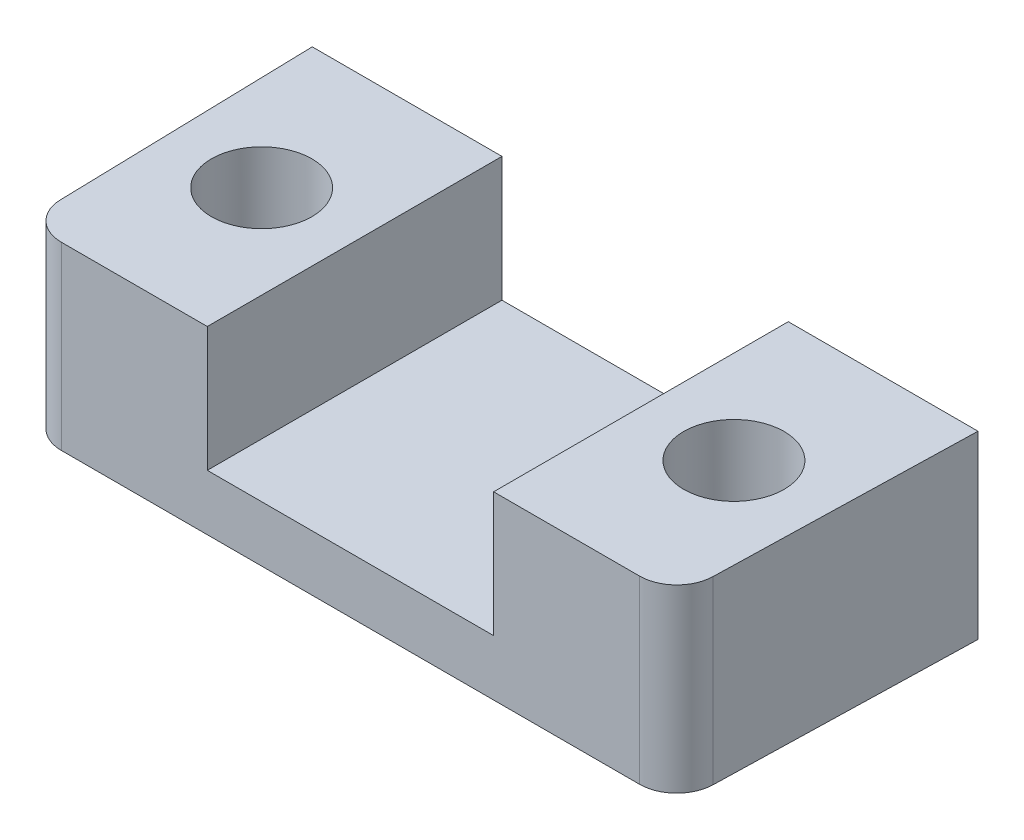
ISO-10303-21;
HEADER;
FILE_DESCRIPTION(('STEP AP214'),'2;1');
FILE_NAME('part.step','',(''),(''),'','','');
FILE_SCHEMA(('AUTOMOTIVE_DESIGN { 1 0 10303 214 1 1 1 1 }'));
ENDSEC;
DATA;
#1=APPLICATION_CONTEXT('core data for automotive mechanical design processes');
#2=APPLICATION_PROTOCOL_DEFINITION('international standard','automotive_design',2000,#1);
#3=PRODUCT_CONTEXT('',#1,'mechanical');
#4=PRODUCT('Part','Part','',(#3));
#5=PRODUCT_RELATED_PRODUCT_CATEGORY('part','',(#4));
#6=PRODUCT_DEFINITION_FORMATION('','',#4);
#7=PRODUCT_DEFINITION_CONTEXT('part definition',#1,'design');
#8=PRODUCT_DEFINITION('design','',#6,#7);
#9=PRODUCT_DEFINITION_SHAPE('','',#8);
#10=(LENGTH_UNIT() NAMED_UNIT(*) SI_UNIT(.MILLI.,.METRE.));
#11=(NAMED_UNIT(*) PLANE_ANGLE_UNIT() SI_UNIT($,.RADIAN.));
#12=(NAMED_UNIT(*) SI_UNIT($,.STERADIAN.) SOLID_ANGLE_UNIT());
#13=UNCERTAINTY_MEASURE_WITH_UNIT(LENGTH_MEASURE(1.E-05),#10,'distance_accuracy_value','');
#14=(GEOMETRIC_REPRESENTATION_CONTEXT(3) GLOBAL_UNCERTAINTY_ASSIGNED_CONTEXT((#13)) GLOBAL_UNIT_ASSIGNED_CONTEXT((#10,
#11,#12)) REPRESENTATION_CONTEXT('',''));
#15=CARTESIAN_POINT('',(0.,0.,0.));
#16=DIRECTION('',(0.,0.,1.));
#17=DIRECTION('',(1.,0.,0.));
#18=AXIS2_PLACEMENT_3D('',#15,#16,#17);
#19=CARTESIAN_POINT('',(15.5503690425272,9.7,-2.00000000000002));
#20=DIRECTION('',(0.,-1.,0.));
#21=DIRECTION('',(0.,0.,-1.));
#22=AXIS2_PLACEMENT_3D('',#19,#20,#21);
#23=PLANE('',#22);
#24=CARTESIAN_POINT('',(12.701076771467,9.7,-7.92453060658859));
#25=DIRECTION('',(0.,-1.,0.));
#26=DIRECTION('',(0.,0.,-1.));
#27=AXIS2_PLACEMENT_3D('',#24,#25,#26);
#28=CIRCLE('',#27,2.69999999999999);
#29=CARTESIAN_POINT('',(12.701076771467,9.7,-10.6245306065886));
#30=VERTEX_POINT('',#29);
#31=EDGE_CURVE('E140',#30,#30,#28,.T.);
#32=ORIENTED_EDGE('',*,*,#31,.T.);
#33=EDGE_LOOP('',(#32));
#34=FACE_BOUND('',#33,.T.);
#35=DIRECTION('',(1.,0.,0.));
#36=VECTOR('',#35,1.);
#37=CARTESIAN_POINT('',(-17.904307085868,9.69999999999999,-15.8490612131772));
#38=LINE('',#37,#36);
#39=CARTESIAN_POINT('',(7.7,9.7,-15.8490612131772));
#40=VERTEX_POINT('',#39);
#41=CARTESIAN_POINT('',(17.904307085868,9.69999999999999,-15.8490612131772));
#42=VERTEX_POINT('',#41);
#43=EDGE_CURVE('E66',#40,#42,#38,.T.);
#44=ORIENTED_EDGE('',*,*,#43,.F.);
#45=DIRECTION('',(0.,0.,1.));
#46=VECTOR('',#45,1.);
#47=CARTESIAN_POINT('',(7.7,9.7,-2.00000000000002));
#48=LINE('',#47,#46);
#49=CARTESIAN_POINT('',(7.7,9.7,0.));
#50=VERTEX_POINT('',#49);
#51=EDGE_CURVE('E12',#40,#50,#48,.T.);
#52=ORIENTED_EDGE('',*,*,#51,.T.);
#53=DIRECTION('',(-1.,0.,0.));
#54=VECTOR('',#53,1.);
#55=CARTESIAN_POINT('',(-15.5503690425272,9.7,0.));
#56=LINE('',#55,#54);
#57=CARTESIAN_POINT('',(15.5503690425272,9.7,0.));
#58=VERTEX_POINT('',#57);
#59=EDGE_CURVE('E156',#58,#50,#56,.T.);
#60=ORIENTED_EDGE('',*,*,#59,.F.);
#61=CARTESIAN_POINT('',(15.5503690425272,9.7,-2.00000000000003));
#62=DIRECTION('',(0.,-1.,0.));
#63=DIRECTION('',(0.,0.,-1.));
#64=AXIS2_PLACEMENT_3D('',#61,#62,#63);
#65=CIRCLE('',#64,2.00000000000001);
#66=CARTESIAN_POINT('',(17.5497186078011,9.7,-1.94899690363395));
#67=VERTEX_POINT('',#66);
#68=EDGE_CURVE('E163',#67,#58,#65,.T.);
#69=ORIENTED_EDGE('',*,*,#68,.F.);
#70=DIRECTION('',(-0.0255015481830356,0.,0.999674782636968));
#71=VECTOR('',#70,1.);
#72=CARTESIAN_POINT('',(17.5497186078011,9.7,-1.94899690363394));
#73=LINE('',#72,#71);
#74=EDGE_CURVE('E160',#42,#67,#73,.T.);
#75=ORIENTED_EDGE('',*,*,#74,.F.);
#76=EDGE_LOOP('',(#44,#52,#60,#69,#75));
#77=FACE_BOUND('',#76,.T.);
#78=ADVANCED_FACE('F42',(#34,#77),#23,.F.);
#79=CARTESIAN_POINT('',(15.5503690425272,0.,-2.00000000000003));
#80=DIRECTION('',(0.,1.,0.));
#81=DIRECTION('',(0.,0.,1.));
#82=AXIS2_PLACEMENT_3D('',#79,#80,#81);
#83=PLANE('',#82);
#84=CARTESIAN_POINT('',(-12.701076771467,0.,-7.92453060658858));
#85=DIRECTION('',(0.,1.,0.));
#86=DIRECTION('',(0.,0.,1.));
#87=AXIS2_PLACEMENT_3D('',#84,#85,#86);
#88=CIRCLE('',#87,2.69999999999999);
#89=CARTESIAN_POINT('',(-12.701076771467,0.,-5.22453060658859));
#90=VERTEX_POINT('',#89);
#91=EDGE_CURVE('E308',#90,#90,#88,.T.);
#92=ORIENTED_EDGE('',*,*,#91,.T.);
#93=EDGE_LOOP('',(#92));
#94=FACE_BOUND('',#93,.T.);
#95=CARTESIAN_POINT('',(12.701076771467,0.,-7.92453060658858));
#96=DIRECTION('',(0.,1.,0.));
#97=DIRECTION('',(0.,0.,1.));
#98=AXIS2_PLACEMENT_3D('',#95,#96,#97);
#99=CIRCLE('',#98,2.69999999999999);
#100=CARTESIAN_POINT('',(12.701076771467,0.,-5.22453060658859));
#101=VERTEX_POINT('',#100);
#102=EDGE_CURVE('E305',#101,#101,#99,.T.);
#103=ORIENTED_EDGE('',*,*,#102,.T.);
#104=EDGE_LOOP('',(#103));
#105=FACE_BOUND('',#104,.T.);
#106=CARTESIAN_POINT('',(15.5503690425272,0.,-2.00000000000003));
#107=DIRECTION('',(0.,1.,0.));
#108=DIRECTION('',(0.,0.,1.));
#109=AXIS2_PLACEMENT_3D('',#106,#107,#108);
#110=CIRCLE('',#109,2.00000000000001);
#111=CARTESIAN_POINT('',(15.5503690425272,0.,0.));
#112=VERTEX_POINT('',#111);
#113=CARTESIAN_POINT('',(17.5497186078011,0.,-1.94899690363395));
#114=VERTEX_POINT('',#113);
#115=EDGE_CURVE('E151',#112,#114,#110,.T.);
#116=ORIENTED_EDGE('',*,*,#115,.F.);
#117=DIRECTION('',(1.,0.,0.));
#118=VECTOR('',#117,1.);
#119=CARTESIAN_POINT('',(-15.5503690425272,0.,0.));
#120=LINE('',#119,#118);
#121=CARTESIAN_POINT('',(-15.5503690425272,0.,0.));
#122=VERTEX_POINT('',#121);
#123=EDGE_CURVE('E180',#122,#112,#120,.T.);
#124=ORIENTED_EDGE('',*,*,#123,.F.);
#125=CARTESIAN_POINT('',(-15.5503690425272,0.,-2.00000000000003));
#126=DIRECTION('',(0.,1.,0.));
#127=DIRECTION('',(0.,0.,1.));
#128=AXIS2_PLACEMENT_3D('',#125,#126,#127);
#129=CIRCLE('',#128,2.00000000000001);
#130=CARTESIAN_POINT('',(-17.5497186078011,0.,-1.94899690363395));
#131=VERTEX_POINT('',#130);
#132=EDGE_CURVE('E177',#131,#122,#129,.T.);
#133=ORIENTED_EDGE('',*,*,#132,.F.);
#134=DIRECTION('',(0.0255015481830353,0.,0.999674782636968));
#135=VECTOR('',#134,1.);
#136=CARTESIAN_POINT('',(-17.904307085868,0.,-15.8490612131772));
#137=LINE('',#136,#135);
#138=CARTESIAN_POINT('',(-17.904307085868,0.,-15.8490612131772));
#139=VERTEX_POINT('',#138);
#140=EDGE_CURVE('E174',#139,#131,#137,.T.);
#141=ORIENTED_EDGE('',*,*,#140,.F.);
#142=DIRECTION('',(-1.,0.,0.));
#143=VECTOR('',#142,1.);
#144=CARTESIAN_POINT('',(-17.904307085868,0.,-15.8490612131772));
#145=LINE('',#144,#143);
#146=CARTESIAN_POINT('',(17.904307085868,0.,-15.8490612131772));
#147=VERTEX_POINT('',#146);
#148=EDGE_CURVE('E171',#147,#139,#145,.T.);
#149=ORIENTED_EDGE('',*,*,#148,.F.);
#150=DIRECTION('',(0.0255015481830356,0.,-0.999674782636968));
#151=VECTOR('',#150,1.);
#152=CARTESIAN_POINT('',(17.5497186078011,0.,-1.94899690363395));
#153=LINE('',#152,#151);
#154=EDGE_CURVE('E168',#114,#147,#153,.T.);
#155=ORIENTED_EDGE('',*,*,#154,.F.);
#156=EDGE_LOOP('',(#116,#124,#133,#141,#149,#155));
#157=FACE_BOUND('',#156,.T.);
#158=ADVANCED_FACE('F217',(#94,#105,#157),#83,.F.);
#159=CARTESIAN_POINT('',(-15.5503690425272,50.8592848535222,0.));
#160=DIRECTION('',(0.,0.,-1.));
#161=DIRECTION('',(-1.,0.,0.));
#162=AXIS2_PLACEMENT_3D('',#159,#160,#161);
#163=PLANE('',#162);
#164=ORIENTED_EDGE('',*,*,#59,.T.);
#165=DIRECTION('',(0.,-1.,0.));
#166=VECTOR('',#165,1.);
#167=CARTESIAN_POINT('',(7.69999999999999,50.8592848535222,0.));
#168=LINE('',#167,#166);
#169=CARTESIAN_POINT('',(7.7,2.99999999999997,0.));
#170=VERTEX_POINT('',#169);
#171=EDGE_CURVE('E146',#50,#170,#168,.T.);
#172=ORIENTED_EDGE('',*,*,#171,.T.);
#173=DIRECTION('',(-1.,0.,0.));
#174=VECTOR('',#173,1.);
#175=CARTESIAN_POINT('',(-15.5503690425272,2.99999999999998,0.));
#176=LINE('',#175,#174);
#177=CARTESIAN_POINT('',(-7.7,2.99999999999997,0.));
#178=VERTEX_POINT('',#177);
#179=EDGE_CURVE('E149',#170,#178,#176,.T.);
#180=ORIENTED_EDGE('',*,*,#179,.T.);
#181=DIRECTION('',(0.,1.,0.));
#182=VECTOR('',#181,1.);
#183=CARTESIAN_POINT('',(-7.70000000000001,50.8592848535222,0.));
#184=LINE('',#183,#182);
#185=CARTESIAN_POINT('',(-7.7,9.7,0.));
#186=VERTEX_POINT('',#185);
#187=EDGE_CURVE('E123',#178,#186,#184,.T.);
#188=ORIENTED_EDGE('',*,*,#187,.T.);
#189=CARTESIAN_POINT('',(-15.5503690425272,9.7,0.));
#190=VERTEX_POINT('',#189);
#191=EDGE_CURVE('E195',#186,#190,#56,.T.);
#192=ORIENTED_EDGE('',*,*,#191,.T.);
#193=DIRECTION('',(0.,-1.,0.));
#194=VECTOR('',#193,1.);
#195=CARTESIAN_POINT('',(-15.5503690425272,50.8592848535222,0.));
#196=LINE('',#195,#194);
#197=EDGE_CURVE('E185',#190,#122,#196,.T.);
#198=ORIENTED_EDGE('',*,*,#197,.T.);
#199=ORIENTED_EDGE('',*,*,#123,.T.);
#200=DIRECTION('',(0.,-1.,0.));
#201=VECTOR('',#200,1.);
#202=CARTESIAN_POINT('',(15.5503690425272,50.8592848535222,0.));
#203=LINE('',#202,#201);
#204=EDGE_CURVE('E183',#58,#112,#203,.T.);
#205=ORIENTED_EDGE('',*,*,#204,.F.);
#206=EDGE_LOOP('',(#164,#172,#180,#188,#192,#198,#199,#205));
#207=FACE_BOUND('',#206,.T.);
#208=ADVANCED_FACE('F203',(#207),#163,.F.);
#209=CARTESIAN_POINT('',(-15.5503690425272,50.8592848535222,-2.00000000000003));
#210=DIRECTION('',(0.,-1.,0.));
#211=DIRECTION('',(0.,0.,-1.));
#212=AXIS2_PLACEMENT_3D('',#209,#210,#211);
#213=CYLINDRICAL_SURFACE('',#212,2.00000000000001);
#214=ORIENTED_EDGE('',*,*,#197,.F.);
#215=CARTESIAN_POINT('',(-15.5503690425272,9.7,-2.00000000000003));
#216=DIRECTION('',(0.,-1.,0.));
#217=DIRECTION('',(0.,0.,-1.));
#218=AXIS2_PLACEMENT_3D('',#215,#216,#217);
#219=CIRCLE('',#218,2.00000000000001);
#220=CARTESIAN_POINT('',(-17.5497186078011,9.7,-1.94899690363395));
#221=VERTEX_POINT('',#220);
#222=EDGE_CURVE('E152',#190,#221,#219,.T.);
#223=ORIENTED_EDGE('',*,*,#222,.T.);
#224=DIRECTION('',(0.,-1.,0.));
#225=VECTOR('',#224,1.);
#226=CARTESIAN_POINT('',(-17.5497186078011,50.8592848535222,-1.94899690363395));
#227=LINE('',#226,#225);
#228=EDGE_CURVE('E187',#221,#131,#227,.T.);
#229=ORIENTED_EDGE('',*,*,#228,.T.);
#230=ORIENTED_EDGE('',*,*,#132,.T.);
#231=EDGE_LOOP('',(#214,#223,#229,#230));
#232=FACE_BOUND('',#231,.T.);
#233=ADVANCED_FACE('F224',(#232),#213,.T.);
#234=CARTESIAN_POINT('',(-17.904307085868,50.8592848535222,-15.8490612131772));
#235=DIRECTION('',(0.999674782636968,0.,-0.0255015481830353));
#236=DIRECTION('',(-0.0255015481830353,0.,-0.999674782636968));
#237=AXIS2_PLACEMENT_3D('',#234,#235,#236);
#238=PLANE('',#237);
#239=ORIENTED_EDGE('',*,*,#228,.F.);
#240=DIRECTION('',(-0.0255015481830353,0.,-0.999674782636968));
#241=VECTOR('',#240,1.);
#242=CARTESIAN_POINT('',(-17.904307085868,9.69999999999999,-15.8490612131772));
#243=LINE('',#242,#241);
#244=CARTESIAN_POINT('',(-17.904307085868,9.69999999999999,-15.8490612131772));
#245=VERTEX_POINT('',#244);
#246=EDGE_CURVE('E155',#221,#245,#243,.T.);
#247=ORIENTED_EDGE('',*,*,#246,.T.);
#248=DIRECTION('',(0.,-1.,0.));
#249=VECTOR('',#248,1.);
#250=CARTESIAN_POINT('',(-17.904307085868,50.8592848535222,-15.8490612131772));
#251=LINE('',#250,#249);
#252=EDGE_CURVE('E189',#245,#139,#251,.T.);
#253=ORIENTED_EDGE('',*,*,#252,.T.);
#254=ORIENTED_EDGE('',*,*,#140,.T.);
#255=EDGE_LOOP('',(#239,#247,#253,#254));
#256=FACE_BOUND('',#255,.T.);
#257=ADVANCED_FACE('F221',(#256),#238,.F.);
#258=CARTESIAN_POINT('',(-17.904307085868,50.8592848535222,-15.8490612131772));
#259=DIRECTION('',(0.,0.,1.));
#260=DIRECTION('',(1.,0.,0.));
#261=AXIS2_PLACEMENT_3D('',#258,#259,#260);
#262=PLANE('',#261);
#263=DIRECTION('',(1.,0.,0.));
#264=VECTOR('',#263,1.);
#265=CARTESIAN_POINT('',(-7.7,2.99999999999997,-15.8490612131772));
#266=LINE('',#265,#264);
#267=CARTESIAN_POINT('',(-7.7,2.99999999999997,-15.8490612131772));
#268=VERTEX_POINT('',#267);
#269=CARTESIAN_POINT('',(7.7,2.99999999999997,-15.8490612131772));
#270=VERTEX_POINT('',#269);
#271=EDGE_CURVE('E127',#268,#270,#266,.T.);
#272=ORIENTED_EDGE('',*,*,#271,.T.);
#273=DIRECTION('',(0.,1.,0.));
#274=VECTOR('',#273,1.);
#275=CARTESIAN_POINT('',(7.7,18.4,-15.8490612131772));
#276=LINE('',#275,#274);
#277=EDGE_CURVE('E138',#270,#40,#276,.T.);
#278=ORIENTED_EDGE('',*,*,#277,.T.);
#279=ORIENTED_EDGE('',*,*,#43,.T.);
#280=DIRECTION('',(0.,-1.,0.));
#281=VECTOR('',#280,1.);
#282=CARTESIAN_POINT('',(17.904307085868,50.8592848535222,-15.8490612131772));
#283=LINE('',#282,#281);
#284=EDGE_CURVE('E191',#42,#147,#283,.T.);
#285=ORIENTED_EDGE('',*,*,#284,.T.);
#286=ORIENTED_EDGE('',*,*,#148,.T.);
#287=ORIENTED_EDGE('',*,*,#252,.F.);
#288=CARTESIAN_POINT('',(-7.7,9.69999999999999,-15.8490612131772));
#289=VERTEX_POINT('',#288);
#290=EDGE_CURVE('E137',#245,#289,#38,.T.);
#291=ORIENTED_EDGE('',*,*,#290,.T.);
#292=DIRECTION('',(0.,-1.,0.));
#293=VECTOR('',#292,1.);
#294=CARTESIAN_POINT('',(-7.7,18.4,-15.8490612131772));
#295=LINE('',#294,#293);
#296=EDGE_CURVE('E58',#289,#268,#295,.T.);
#297=ORIENTED_EDGE('',*,*,#296,.T.);
#298=EDGE_LOOP('',(#272,#278,#279,#285,#286,#287,#291,#297));
#299=FACE_BOUND('',#298,.T.);
#300=ADVANCED_FACE('F135',(#299),#262,.F.);
#301=CARTESIAN_POINT('',(17.5497186078011,50.8592848535222,-1.94899690363395));
#302=DIRECTION('',(-0.999674782636968,0.,-0.0255015481830356));
#303=DIRECTION('',(-0.0255015481830356,0.,0.999674782636968));
#304=AXIS2_PLACEMENT_3D('',#301,#302,#303);
#305=PLANE('',#304);
#306=ORIENTED_EDGE('',*,*,#284,.F.);
#307=ORIENTED_EDGE('',*,*,#74,.T.);
#308=DIRECTION('',(0.,-1.,0.));
#309=VECTOR('',#308,1.);
#310=CARTESIAN_POINT('',(17.5497186078011,50.8592848535222,-1.94899690363395));
#311=LINE('',#310,#309);
#312=EDGE_CURVE('E193',#67,#114,#311,.T.);
#313=ORIENTED_EDGE('',*,*,#312,.T.);
#314=ORIENTED_EDGE('',*,*,#154,.T.);
#315=EDGE_LOOP('',(#306,#307,#313,#314));
#316=FACE_BOUND('',#315,.T.);
#317=ADVANCED_FACE('F210',(#316),#305,.F.);
#318=CARTESIAN_POINT('',(15.5503690425272,50.8592848535222,-2.00000000000003));
#319=DIRECTION('',(0.,-1.,0.));
#320=DIRECTION('',(0.,0.,-1.));
#321=AXIS2_PLACEMENT_3D('',#318,#319,#320);
#322=CYLINDRICAL_SURFACE('',#321,2.00000000000001);
#323=ORIENTED_EDGE('',*,*,#312,.F.);
#324=ORIENTED_EDGE('',*,*,#68,.T.);
#325=ORIENTED_EDGE('',*,*,#204,.T.);
#326=ORIENTED_EDGE('',*,*,#115,.T.);
#327=EDGE_LOOP('',(#323,#324,#325,#326));
#328=FACE_BOUND('',#327,.T.);
#329=ADVANCED_FACE('F44',(#328),#322,.T.);
#330=CARTESIAN_POINT('',(-12.701076771467,9.7,-7.92453060658859));
#331=DIRECTION('',(0.,-1.,0.));
#332=DIRECTION('',(0.,0.,-1.));
#333=AXIS2_PLACEMENT_3D('',#330,#331,#332);
#334=CIRCLE('',#333,2.69999999999999);
#335=CARTESIAN_POINT('',(-12.701076771467,9.7,-10.6245306065886));
#336=VERTEX_POINT('',#335);
#337=EDGE_CURVE('E46',#336,#336,#334,.T.);
#338=ORIENTED_EDGE('',*,*,#337,.T.);
#339=EDGE_LOOP('',(#338));
#340=FACE_BOUND('',#339,.T.);
#341=ORIENTED_EDGE('',*,*,#191,.F.);
#342=DIRECTION('',(0.,0.,-1.));
#343=VECTOR('',#342,1.);
#344=CARTESIAN_POINT('',(-7.7,9.7,-2.00000000000002));
#345=LINE('',#344,#343);
#346=EDGE_CURVE('E51',#186,#289,#345,.T.);
#347=ORIENTED_EDGE('',*,*,#346,.T.);
#348=ORIENTED_EDGE('',*,*,#290,.F.);
#349=ORIENTED_EDGE('',*,*,#246,.F.);
#350=ORIENTED_EDGE('',*,*,#222,.F.);
#351=EDGE_LOOP('',(#341,#347,#348,#349,#350));
#352=FACE_BOUND('',#351,.T.);
#353=ADVANCED_FACE('F200',(#340,#352),#23,.F.);
#354=CARTESIAN_POINT('',(-7.7,2.99999999999997,-15.8490612131772));
#355=DIRECTION('',(0.,-1.,0.));
#356=DIRECTION('',(0.,0.,-1.));
#357=AXIS2_PLACEMENT_3D('',#354,#355,#356);
#358=PLANE('',#357);
#359=DIRECTION('',(0.,0.,1.));
#360=VECTOR('',#359,1.);
#361=CARTESIAN_POINT('',(7.7,2.99999999999997,-15.8490612131772));
#362=LINE('',#361,#360);
#363=EDGE_CURVE('E126',#270,#170,#362,.T.);
#364=ORIENTED_EDGE('',*,*,#363,.F.);
#365=ORIENTED_EDGE('',*,*,#271,.F.);
#366=DIRECTION('',(0.,0.,1.));
#367=VECTOR('',#366,1.);
#368=CARTESIAN_POINT('',(-7.7,2.99999999999997,-15.8490612131772));
#369=LINE('',#368,#367);
#370=EDGE_CURVE('E119',#268,#178,#369,.T.);
#371=ORIENTED_EDGE('',*,*,#370,.T.);
#372=ORIENTED_EDGE('',*,*,#179,.F.);
#373=EDGE_LOOP('',(#364,#365,#371,#372));
#374=FACE_BOUND('',#373,.T.);
#375=ADVANCED_FACE('F130',(#374),#358,.F.);
#376=CARTESIAN_POINT('',(7.7,18.4,-15.8490612131772));
#377=DIRECTION('',(1.,0.,0.));
#378=DIRECTION('',(0.,1.,0.));
#379=AXIS2_PLACEMENT_3D('',#376,#377,#378);
#380=PLANE('',#379);
#381=ORIENTED_EDGE('',*,*,#51,.F.);
#382=ORIENTED_EDGE('',*,*,#277,.F.);
#383=ORIENTED_EDGE('',*,*,#363,.T.);
#384=ORIENTED_EDGE('',*,*,#171,.F.);
#385=EDGE_LOOP('',(#381,#382,#383,#384));
#386=FACE_BOUND('',#385,.T.);
#387=ADVANCED_FACE('F205',(#386),#380,.F.);
#388=CARTESIAN_POINT('',(-7.7,18.4,-15.8490612131772));
#389=DIRECTION('',(-1.,0.,0.));
#390=DIRECTION('',(0.,-1.,0.));
#391=AXIS2_PLACEMENT_3D('',#388,#389,#390);
#392=PLANE('',#391);
#393=ORIENTED_EDGE('',*,*,#370,.F.);
#394=ORIENTED_EDGE('',*,*,#296,.F.);
#395=ORIENTED_EDGE('',*,*,#346,.F.);
#396=ORIENTED_EDGE('',*,*,#187,.F.);
#397=EDGE_LOOP('',(#393,#394,#395,#396));
#398=FACE_BOUND('',#397,.T.);
#399=ADVANCED_FACE('F121',(#398),#392,.F.);
#400=CARTESIAN_POINT('',(-12.701076771467,0.,-7.92453060658858));
#401=DIRECTION('',(0.,1.,0.));
#402=DIRECTION('',(0.,0.,1.));
#403=AXIS2_PLACEMENT_3D('',#400,#401,#402);
#404=CYLINDRICAL_SURFACE('',#403,2.69999999999999);
#405=ORIENTED_EDGE('',*,*,#91,.F.);
#406=EDGE_LOOP('',(#405));
#407=FACE_BOUND('',#406,.T.);
#408=ORIENTED_EDGE('',*,*,#337,.F.);
#409=EDGE_LOOP('',(#408));
#410=FACE_BOUND('',#409,.T.);
#411=ADVANCED_FACE('F278',(#407,#410),#404,.F.);
#412=CARTESIAN_POINT('',(12.701076771467,0.,-7.92453060658858));
#413=DIRECTION('',(0.,1.,0.));
#414=DIRECTION('',(0.,0.,1.));
#415=AXIS2_PLACEMENT_3D('',#412,#413,#414);
#416=CYLINDRICAL_SURFACE('',#415,2.69999999999999);
#417=ORIENTED_EDGE('',*,*,#102,.F.);
#418=EDGE_LOOP('',(#417));
#419=FACE_BOUND('',#418,.T.);
#420=ORIENTED_EDGE('',*,*,#31,.F.);
#421=EDGE_LOOP('',(#420));
#422=FACE_BOUND('',#421,.T.);
#423=ADVANCED_FACE('F289',(#419,#422),#416,.F.);
#424=CLOSED_SHELL('',(#78,#158,#208,#233,#257,#300,#317,#329,#353,#375,#387,#399,#411,#423));
#425=MANIFOLD_SOLID_BREP('B2',#424);
#426=ADVANCED_BREP_SHAPE_REPRESENTATION('',(#18,#425),#14);
#427=SHAPE_DEFINITION_REPRESENTATION(#9,#426);
ENDSEC;
END-ISO-10303-21;
